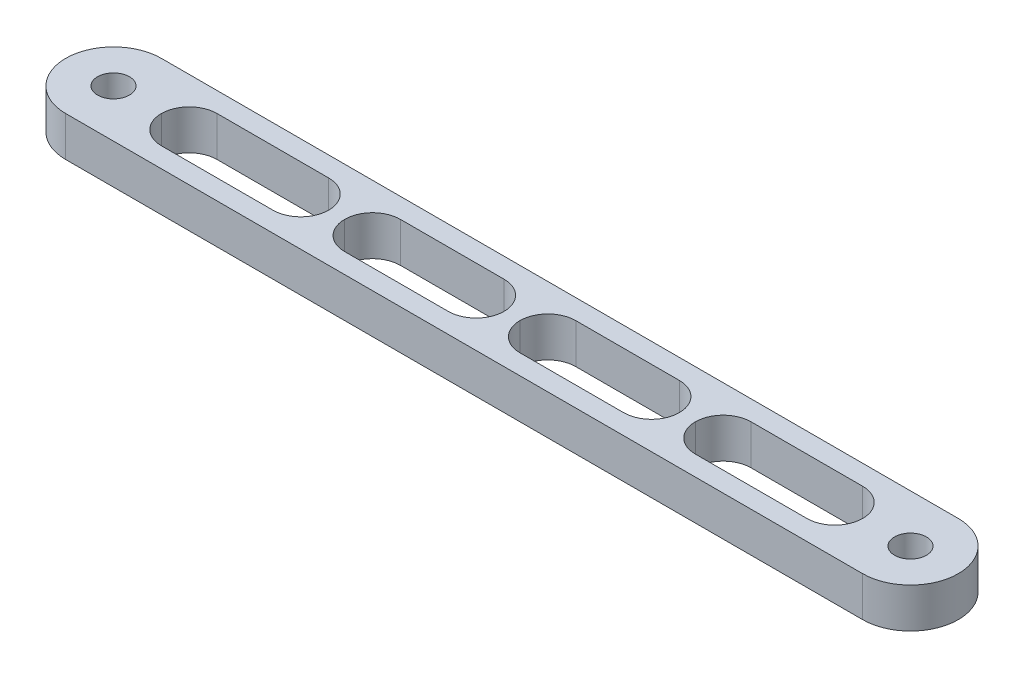
ISO-10303-21;
HEADER;
FILE_DESCRIPTION(('STEP AP214'),'2;1');
FILE_NAME('part.step','',(''),(''),'','','');
FILE_SCHEMA(('AUTOMOTIVE_DESIGN { 1 0 10303 214 1 1 1 1 }'));
ENDSEC;
DATA;
#1=APPLICATION_CONTEXT('core data for automotive mechanical design processes');
#2=APPLICATION_PROTOCOL_DEFINITION('international standard','automotive_design',2000,#1);
#3=PRODUCT_CONTEXT('',#1,'mechanical');
#4=PRODUCT('Part','Part','',(#3));
#5=PRODUCT_RELATED_PRODUCT_CATEGORY('part','',(#4));
#6=PRODUCT_DEFINITION_FORMATION('','',#4);
#7=PRODUCT_DEFINITION_CONTEXT('part definition',#1,'design');
#8=PRODUCT_DEFINITION('design','',#6,#7);
#9=PRODUCT_DEFINITION_SHAPE('','',#8);
#10=(LENGTH_UNIT() NAMED_UNIT(*) SI_UNIT(.MILLI.,.METRE.));
#11=(NAMED_UNIT(*) PLANE_ANGLE_UNIT() SI_UNIT($,.RADIAN.));
#12=(NAMED_UNIT(*) SI_UNIT($,.STERADIAN.) SOLID_ANGLE_UNIT());
#13=UNCERTAINTY_MEASURE_WITH_UNIT(LENGTH_MEASURE(1.E-05),#10,'distance_accuracy_value','');
#14=(GEOMETRIC_REPRESENTATION_CONTEXT(3) GLOBAL_UNCERTAINTY_ASSIGNED_CONTEXT((#13)) GLOBAL_UNIT_ASSIGNED_CONTEXT((#10,
#11,#12)) REPRESENTATION_CONTEXT('',''));
#15=CARTESIAN_POINT('',(0.,0.,0.));
#16=DIRECTION('',(0.,0.,1.));
#17=DIRECTION('',(1.,0.,0.));
#18=AXIS2_PLACEMENT_3D('',#15,#16,#17);
#19=CARTESIAN_POINT('',(-200.,10.,0.));
#20=DIRECTION('',(0.,1.,0.));
#21=DIRECTION('',(0.,0.,1.));
#22=AXIS2_PLACEMENT_3D('',#19,#20,#21);
#23=PLANE('',#22);
#24=CARTESIAN_POINT('',(-200.,10.,0.));
#25=DIRECTION('',(0.,1.,0.));
#26=DIRECTION('',(0.,0.,1.));
#27=AXIS2_PLACEMENT_3D('',#24,#25,#26);
#28=CIRCLE('',#27,3.99999999999999);
#29=CARTESIAN_POINT('',(-200.,10.,3.99999999999999));
#30=VERTEX_POINT('',#29);
#31=EDGE_CURVE('E266',#30,#30,#28,.T.);
#32=ORIENTED_EDGE('',*,*,#31,.F.);
#33=EDGE_LOOP('',(#32));
#34=FACE_BOUND('',#33,.T.);
#35=CARTESIAN_POINT('',(-200.,10.,0.));
#36=DIRECTION('',(0.,1.,0.));
#37=DIRECTION('',(0.,0.,1.));
#38=AXIS2_PLACEMENT_3D('',#35,#36,#37);
#39=CIRCLE('',#38,12.);
#40=CARTESIAN_POINT('',(-200.,10.,-12.));
#41=VERTEX_POINT('',#40);
#42=CARTESIAN_POINT('',(-200.,10.,12.));
#43=VERTEX_POINT('',#42);
#44=EDGE_CURVE('E225',#41,#43,#39,.T.);
#45=ORIENTED_EDGE('',*,*,#44,.T.);
#46=DIRECTION('',(1.,0.,0.));
#47=VECTOR('',#46,1.);
#48=CARTESIAN_POINT('',(-200.,10.,12.));
#49=LINE('',#48,#47);
#50=CARTESIAN_POINT('',(0.,10.,12.));
#51=VERTEX_POINT('',#50);
#52=EDGE_CURVE('E229',#43,#51,#49,.T.);
#53=ORIENTED_EDGE('',*,*,#52,.T.);
#54=CARTESIAN_POINT('',(0.,10.,0.));
#55=DIRECTION('',(0.,1.,0.));
#56=DIRECTION('',(0.,0.,1.));
#57=AXIS2_PLACEMENT_3D('',#54,#55,#56);
#58=CIRCLE('',#57,12.);
#59=CARTESIAN_POINT('',(0.,10.,-12.));
#60=VERTEX_POINT('',#59);
#61=EDGE_CURVE('E253',#51,#60,#58,.T.);
#62=ORIENTED_EDGE('',*,*,#61,.T.);
#63=DIRECTION('',(-1.,0.,0.));
#64=VECTOR('',#63,1.);
#65=CARTESIAN_POINT('',(-200.,10.,-12.));
#66=LINE('',#65,#64);
#67=EDGE_CURVE('E232',#60,#41,#66,.T.);
#68=ORIENTED_EDGE('',*,*,#67,.T.);
#69=EDGE_LOOP('',(#45,#53,#62,#68));
#70=FACE_BOUND('',#69,.T.);
#71=CARTESIAN_POINT('',(0.,10.,0.));
#72=DIRECTION('',(0.,1.,0.));
#73=DIRECTION('',(0.,0.,1.));
#74=AXIS2_PLACEMENT_3D('',#71,#72,#73);
#75=CIRCLE('',#74,4.);
#76=CARTESIAN_POINT('',(0.,10.,4.));
#77=VERTEX_POINT('',#76);
#78=EDGE_CURVE('E493',#77,#77,#75,.T.);
#79=ORIENTED_EDGE('',*,*,#78,.F.);
#80=EDGE_LOOP('',(#79));
#81=FACE_BOUND('',#80,.T.);
#82=CARTESIAN_POINT('',(-181.,10.,0.));
#83=DIRECTION('',(0.,1.,0.));
#84=DIRECTION('',(0.,0.,1.));
#85=AXIS2_PLACEMENT_3D('',#82,#83,#84);
#86=CIRCLE('',#85,7.);
#87=CARTESIAN_POINT('',(-181.,10.,7.));
#88=VERTEX_POINT('',#87);
#89=CARTESIAN_POINT('',(-188.,10.,0.));
#90=VERTEX_POINT('',#89);
#91=EDGE_CURVE('E56',#88,#90,#86,.F.);
#92=ORIENTED_EDGE('',*,*,#91,.T.);
#93=CARTESIAN_POINT('',(-181.,10.,0.));
#94=DIRECTION('',(0.,1.,0.));
#95=DIRECTION('',(0.,0.,1.));
#96=AXIS2_PLACEMENT_3D('',#93,#94,#95);
#97=CIRCLE('',#96,7.);
#98=CARTESIAN_POINT('',(-181.,10.,-6.99999999999998));
#99=VERTEX_POINT('',#98);
#100=EDGE_CURVE('E11',#90,#99,#97,.F.);
#101=ORIENTED_EDGE('',*,*,#100,.T.);
#102=DIRECTION('',(-1.,0.,0.));
#103=VECTOR('',#102,1.);
#104=CARTESIAN_POINT('',(-146.,10.,-6.99999999999998));
#105=LINE('',#104,#103);
#106=CARTESIAN_POINT('',(-153.,10.,-6.99999999999998));
#107=VERTEX_POINT('',#106);
#108=EDGE_CURVE('E469',#107,#99,#105,.T.);
#109=ORIENTED_EDGE('',*,*,#108,.F.);
#110=CARTESIAN_POINT('',(-153.,10.,0.));
#111=DIRECTION('',(0.,1.,0.));
#112=DIRECTION('',(0.,0.,1.));
#113=AXIS2_PLACEMENT_3D('',#110,#111,#112);
#114=CIRCLE('',#113,7.);
#115=CARTESIAN_POINT('',(-146.,10.,0.));
#116=VERTEX_POINT('',#115);
#117=EDGE_CURVE('E376',#107,#116,#114,.F.);
#118=ORIENTED_EDGE('',*,*,#117,.T.);
#119=CARTESIAN_POINT('',(-153.,10.,0.));
#120=DIRECTION('',(0.,1.,0.));
#121=DIRECTION('',(0.,0.,1.));
#122=AXIS2_PLACEMENT_3D('',#119,#120,#121);
#123=CIRCLE('',#122,7.);
#124=CARTESIAN_POINT('',(-153.,10.,7.));
#125=VERTEX_POINT('',#124);
#126=EDGE_CURVE('E382',#116,#125,#123,.F.);
#127=ORIENTED_EDGE('',*,*,#126,.T.);
#128=DIRECTION('',(1.,0.,0.));
#129=VECTOR('',#128,1.);
#130=CARTESIAN_POINT('',(-188.,10.,7.));
#131=LINE('',#130,#129);
#132=EDGE_CURVE('E475',#88,#125,#131,.T.);
#133=ORIENTED_EDGE('',*,*,#132,.F.);
#134=EDGE_LOOP('',(#92,#101,#109,#118,#127,#133));
#135=FACE_BOUND('',#134,.T.);
#136=DIRECTION('',(1.,0.,0.));
#137=VECTOR('',#136,1.);
#138=CARTESIAN_POINT('',(-142.,10.,6.99999999999999));
#139=LINE('',#138,#137);
#140=CARTESIAN_POINT('',(-135.,10.,6.99999999999999));
#141=VERTEX_POINT('',#140);
#142=CARTESIAN_POINT('',(-109.,10.,6.99999999999999));
#143=VERTEX_POINT('',#142);
#144=EDGE_CURVE('E491',#141,#143,#139,.T.);
#145=ORIENTED_EDGE('',*,*,#144,.F.);
#146=CARTESIAN_POINT('',(-135.,10.,0.));
#147=DIRECTION('',(0.,1.,0.));
#148=DIRECTION('',(0.,0.,1.));
#149=AXIS2_PLACEMENT_3D('',#146,#147,#148);
#150=CIRCLE('',#149,7.);
#151=CARTESIAN_POINT('',(-142.,10.,0.));
#152=VERTEX_POINT('',#151);
#153=EDGE_CURVE('E418',#141,#152,#150,.F.);
#154=ORIENTED_EDGE('',*,*,#153,.T.);
#155=CARTESIAN_POINT('',(-135.,10.,0.));
#156=DIRECTION('',(0.,1.,0.));
#157=DIRECTION('',(0.,0.,1.));
#158=AXIS2_PLACEMENT_3D('',#155,#156,#157);
#159=CIRCLE('',#158,7.);
#160=CARTESIAN_POINT('',(-135.,10.,-6.99999999999998));
#161=VERTEX_POINT('',#160);
#162=EDGE_CURVE('E340',#152,#161,#159,.F.);
#163=ORIENTED_EDGE('',*,*,#162,.T.);
#164=DIRECTION('',(-1.,0.,0.));
#165=VECTOR('',#164,1.);
#166=CARTESIAN_POINT('',(-102.,10.,-6.99999999999999));
#167=LINE('',#166,#165);
#168=CARTESIAN_POINT('',(-109.,10.,-6.99999999999999));
#169=VERTEX_POINT('',#168);
#170=EDGE_CURVE('E832',#169,#161,#167,.T.);
#171=ORIENTED_EDGE('',*,*,#170,.F.);
#172=CARTESIAN_POINT('',(-109.,10.,0.));
#173=DIRECTION('',(0.,1.,0.));
#174=DIRECTION('',(0.,0.,1.));
#175=AXIS2_PLACEMENT_3D('',#172,#173,#174);
#176=CIRCLE('',#175,7.);
#177=CARTESIAN_POINT('',(-102.,10.,0.));
#178=VERTEX_POINT('',#177);
#179=EDGE_CURVE('E370',#169,#178,#176,.F.);
#180=ORIENTED_EDGE('',*,*,#179,.T.);
#181=CARTESIAN_POINT('',(-109.,10.,0.));
#182=DIRECTION('',(0.,1.,0.));
#183=DIRECTION('',(0.,0.,1.));
#184=AXIS2_PLACEMENT_3D('',#181,#182,#183);
#185=CIRCLE('',#184,7.);
#186=EDGE_CURVE('E388',#178,#143,#185,.F.);
#187=ORIENTED_EDGE('',*,*,#186,.T.);
#188=EDGE_LOOP('',(#145,#154,#163,#171,#180,#187));
#189=FACE_BOUND('',#188,.T.);
#190=DIRECTION('',(1.,0.,0.));
#191=VECTOR('',#190,1.);
#192=CARTESIAN_POINT('',(-98.,10.,6.99999999999998));
#193=LINE('',#192,#191);
#194=CARTESIAN_POINT('',(-91.,10.,6.99999999999998));
#195=VERTEX_POINT('',#194);
#196=CARTESIAN_POINT('',(-65.,10.,6.99999999999998));
#197=VERTEX_POINT('',#196);
#198=EDGE_CURVE('E858',#195,#197,#193,.T.);
#199=ORIENTED_EDGE('',*,*,#198,.F.);
#200=CARTESIAN_POINT('',(-91.,10.,0.));
#201=DIRECTION('',(0.,1.,0.));
#202=DIRECTION('',(0.,0.,1.));
#203=AXIS2_PLACEMENT_3D('',#200,#201,#202);
#204=CIRCLE('',#203,7.);
#205=CARTESIAN_POINT('',(-98.,10.,0.));
#206=VERTEX_POINT('',#205);
#207=EDGE_CURVE('E412',#195,#206,#204,.F.);
#208=ORIENTED_EDGE('',*,*,#207,.T.);
#209=CARTESIAN_POINT('',(-91.,10.,0.));
#210=DIRECTION('',(0.,1.,0.));
#211=DIRECTION('',(0.,0.,1.));
#212=AXIS2_PLACEMENT_3D('',#209,#210,#211);
#213=CIRCLE('',#212,7.);
#214=CARTESIAN_POINT('',(-91.,10.,-6.99999999999999));
#215=VERTEX_POINT('',#214);
#216=EDGE_CURVE('E346',#206,#215,#213,.F.);
#217=ORIENTED_EDGE('',*,*,#216,.T.);
#218=DIRECTION('',(-1.,0.,0.));
#219=VECTOR('',#218,1.);
#220=CARTESIAN_POINT('',(-98.,10.,-6.99999999999999));
#221=LINE('',#220,#219);
#222=CARTESIAN_POINT('',(-65.,10.,-6.99999999999999));
#223=VERTEX_POINT('',#222);
#224=EDGE_CURVE('E862',#223,#215,#221,.T.);
#225=ORIENTED_EDGE('',*,*,#224,.F.);
#226=CARTESIAN_POINT('',(-65.,10.,0.));
#227=DIRECTION('',(0.,1.,0.));
#228=DIRECTION('',(0.,0.,1.));
#229=AXIS2_PLACEMENT_3D('',#226,#227,#228);
#230=CIRCLE('',#229,7.);
#231=CARTESIAN_POINT('',(-58.,10.,0.));
#232=VERTEX_POINT('',#231);
#233=EDGE_CURVE('E358',#223,#232,#230,.F.);
#234=ORIENTED_EDGE('',*,*,#233,.T.);
#235=CARTESIAN_POINT('',(-65.,10.,0.));
#236=DIRECTION('',(0.,1.,0.));
#237=DIRECTION('',(0.,0.,1.));
#238=AXIS2_PLACEMENT_3D('',#235,#236,#237);
#239=CIRCLE('',#238,7.);
#240=EDGE_CURVE('E394',#232,#197,#239,.F.);
#241=ORIENTED_EDGE('',*,*,#240,.T.);
#242=EDGE_LOOP('',(#199,#208,#217,#225,#234,#241));
#243=FACE_BOUND('',#242,.T.);
#244=DIRECTION('',(1.,0.,0.));
#245=VECTOR('',#244,1.);
#246=CARTESIAN_POINT('',(-54.,10.,6.99999999999997));
#247=LINE('',#246,#245);
#248=CARTESIAN_POINT('',(-47.,10.,6.99999999999997));
#249=VERTEX_POINT('',#248);
#250=CARTESIAN_POINT('',(-19.,10.,6.99999999999999));
#251=VERTEX_POINT('',#250);
#252=EDGE_CURVE('E875',#249,#251,#247,.T.);
#253=ORIENTED_EDGE('',*,*,#252,.F.);
#254=CARTESIAN_POINT('',(-47.,10.,0.));
#255=DIRECTION('',(0.,1.,0.));
#256=DIRECTION('',(0.,0.,1.));
#257=AXIS2_PLACEMENT_3D('',#254,#255,#256);
#258=CIRCLE('',#257,7.);
#259=CARTESIAN_POINT('',(-54.,10.,0.));
#260=VERTEX_POINT('',#259);
#261=EDGE_CURVE('E406',#249,#260,#258,.F.);
#262=ORIENTED_EDGE('',*,*,#261,.T.);
#263=CARTESIAN_POINT('',(-47.,10.,0.));
#264=DIRECTION('',(0.,1.,0.));
#265=DIRECTION('',(0.,0.,1.));
#266=AXIS2_PLACEMENT_3D('',#263,#264,#265);
#267=CIRCLE('',#266,7.);
#268=CARTESIAN_POINT('',(-47.,10.,-6.99999999999999));
#269=VERTEX_POINT('',#268);
#270=EDGE_CURVE('E352',#260,#269,#267,.F.);
#271=ORIENTED_EDGE('',*,*,#270,.T.);
#272=DIRECTION('',(-1.,0.,0.));
#273=VECTOR('',#272,1.);
#274=CARTESIAN_POINT('',(-54.,10.,-6.99999999999999));
#275=LINE('',#274,#273);
#276=CARTESIAN_POINT('',(-19.,10.,-6.99999999999998));
#277=VERTEX_POINT('',#276);
#278=EDGE_CURVE('E900',#277,#269,#275,.T.);
#279=ORIENTED_EDGE('',*,*,#278,.F.);
#280=CARTESIAN_POINT('',(-19.,10.,0.));
#281=DIRECTION('',(0.,1.,0.));
#282=DIRECTION('',(0.,0.,1.));
#283=AXIS2_PLACEMENT_3D('',#280,#281,#282);
#284=CIRCLE('',#283,7.);
#285=CARTESIAN_POINT('',(-12.,10.,0.));
#286=VERTEX_POINT('',#285);
#287=EDGE_CURVE('E364',#277,#286,#284,.F.);
#288=ORIENTED_EDGE('',*,*,#287,.T.);
#289=CARTESIAN_POINT('',(-19.,10.,0.));
#290=DIRECTION('',(0.,1.,0.));
#291=DIRECTION('',(0.,0.,1.));
#292=AXIS2_PLACEMENT_3D('',#289,#290,#291);
#293=CIRCLE('',#292,7.);
#294=EDGE_CURVE('E400',#286,#251,#293,.F.);
#295=ORIENTED_EDGE('',*,*,#294,.T.);
#296=EDGE_LOOP('',(#253,#262,#271,#279,#288,#295));
#297=FACE_BOUND('',#296,.T.);
#298=ADVANCED_FACE('F39',(#34,#70,#81,#135,#189,#243,#297),#23,.T.);
#299=CARTESIAN_POINT('',(-200.,0.,0.));
#300=DIRECTION('',(0.,1.,0.));
#301=DIRECTION('',(0.,0.,1.));
#302=AXIS2_PLACEMENT_3D('',#299,#300,#301);
#303=PLANE('',#302);
#304=DIRECTION('',(1.,0.,0.));
#305=VECTOR('',#304,1.);
#306=CARTESIAN_POINT('',(-98.,0.,6.99999999999998));
#307=LINE('',#306,#305);
#308=CARTESIAN_POINT('',(-91.,0.,6.99999999999998));
#309=VERTEX_POINT('',#308);
#310=CARTESIAN_POINT('',(-65.,0.,6.99999999999998));
#311=VERTEX_POINT('',#310);
#312=EDGE_CURVE('E868',#309,#311,#307,.T.);
#313=ORIENTED_EDGE('',*,*,#312,.T.);
#314=CARTESIAN_POINT('',(-65.,0.,0.));
#315=DIRECTION('',(0.,1.,0.));
#316=DIRECTION('',(0.,0.,1.));
#317=AXIS2_PLACEMENT_3D('',#314,#315,#316);
#318=CIRCLE('',#317,7.);
#319=CARTESIAN_POINT('',(-58.,0.,0.));
#320=VERTEX_POINT('',#319);
#321=EDGE_CURVE('E391',#311,#320,#318,.T.);
#322=ORIENTED_EDGE('',*,*,#321,.T.);
#323=CARTESIAN_POINT('',(-65.,0.,0.));
#324=DIRECTION('',(0.,1.,0.));
#325=DIRECTION('',(0.,0.,1.));
#326=AXIS2_PLACEMENT_3D('',#323,#324,#325);
#327=CIRCLE('',#326,7.);
#328=CARTESIAN_POINT('',(-65.,0.,-6.99999999999999));
#329=VERTEX_POINT('',#328);
#330=EDGE_CURVE('E355',#320,#329,#327,.T.);
#331=ORIENTED_EDGE('',*,*,#330,.T.);
#332=DIRECTION('',(-1.,0.,0.));
#333=VECTOR('',#332,1.);
#334=CARTESIAN_POINT('',(-98.,0.,-6.99999999999999));
#335=LINE('',#334,#333);
#336=CARTESIAN_POINT('',(-91.,0.,-6.99999999999999));
#337=VERTEX_POINT('',#336);
#338=EDGE_CURVE('E872',#329,#337,#335,.T.);
#339=ORIENTED_EDGE('',*,*,#338,.T.);
#340=CARTESIAN_POINT('',(-91.,0.,0.));
#341=DIRECTION('',(0.,1.,0.));
#342=DIRECTION('',(0.,0.,1.));
#343=AXIS2_PLACEMENT_3D('',#340,#341,#342);
#344=CIRCLE('',#343,7.);
#345=CARTESIAN_POINT('',(-98.,0.,0.));
#346=VERTEX_POINT('',#345);
#347=EDGE_CURVE('E343',#337,#346,#344,.T.);
#348=ORIENTED_EDGE('',*,*,#347,.T.);
#349=CARTESIAN_POINT('',(-91.,0.,0.));
#350=DIRECTION('',(0.,1.,0.));
#351=DIRECTION('',(0.,0.,1.));
#352=AXIS2_PLACEMENT_3D('',#349,#350,#351);
#353=CIRCLE('',#352,7.);
#354=EDGE_CURVE('E409',#346,#309,#353,.T.);
#355=ORIENTED_EDGE('',*,*,#354,.T.);
#356=EDGE_LOOP('',(#313,#322,#331,#339,#348,#355));
#357=FACE_BOUND('',#356,.T.);
#358=DIRECTION('',(1.,0.,0.));
#359=VECTOR('',#358,1.);
#360=CARTESIAN_POINT('',(-188.,0.,7.));
#361=LINE('',#360,#359);
#362=CARTESIAN_POINT('',(-181.,0.,7.));
#363=VERTEX_POINT('',#362);
#364=CARTESIAN_POINT('',(-153.,0.,7.));
#365=VERTEX_POINT('',#364);
#366=EDGE_CURVE('E476',#363,#365,#361,.T.);
#367=ORIENTED_EDGE('',*,*,#366,.T.);
#368=CARTESIAN_POINT('',(-153.,0.,0.));
#369=DIRECTION('',(0.,1.,0.));
#370=DIRECTION('',(0.,0.,1.));
#371=AXIS2_PLACEMENT_3D('',#368,#369,#370);
#372=CIRCLE('',#371,7.);
#373=CARTESIAN_POINT('',(-146.,0.,0.));
#374=VERTEX_POINT('',#373);
#375=EDGE_CURVE('E379',#365,#374,#372,.T.);
#376=ORIENTED_EDGE('',*,*,#375,.T.);
#377=CARTESIAN_POINT('',(-153.,0.,0.));
#378=DIRECTION('',(0.,1.,0.));
#379=DIRECTION('',(0.,0.,1.));
#380=AXIS2_PLACEMENT_3D('',#377,#378,#379);
#381=CIRCLE('',#380,7.);
#382=CARTESIAN_POINT('',(-153.,0.,-6.99999999999998));
#383=VERTEX_POINT('',#382);
#384=EDGE_CURVE('E373',#374,#383,#381,.T.);
#385=ORIENTED_EDGE('',*,*,#384,.T.);
#386=DIRECTION('',(-1.,0.,0.));
#387=VECTOR('',#386,1.);
#388=CARTESIAN_POINT('',(-146.,0.,-6.99999999999998));
#389=LINE('',#388,#387);
#390=CARTESIAN_POINT('',(-181.,0.,-6.99999999999998));
#391=VERTEX_POINT('',#390);
#392=EDGE_CURVE('E484',#383,#391,#389,.T.);
#393=ORIENTED_EDGE('',*,*,#392,.T.);
#394=CARTESIAN_POINT('',(-181.,0.,0.));
#395=DIRECTION('',(0.,1.,0.));
#396=DIRECTION('',(0.,0.,1.));
#397=AXIS2_PLACEMENT_3D('',#394,#395,#396);
#398=CIRCLE('',#397,7.);
#399=CARTESIAN_POINT('',(-188.,0.,0.));
#400=VERTEX_POINT('',#399);
#401=EDGE_CURVE('E49',#391,#400,#398,.T.);
#402=ORIENTED_EDGE('',*,*,#401,.T.);
#403=CARTESIAN_POINT('',(-181.,0.,0.));
#404=DIRECTION('',(0.,1.,0.));
#405=DIRECTION('',(0.,0.,1.));
#406=AXIS2_PLACEMENT_3D('',#403,#404,#405);
#407=CIRCLE('',#406,7.);
#408=EDGE_CURVE('E421',#400,#363,#407,.T.);
#409=ORIENTED_EDGE('',*,*,#408,.T.);
#410=EDGE_LOOP('',(#367,#376,#385,#393,#402,#409));
#411=FACE_BOUND('',#410,.T.);
#412=DIRECTION('',(1.,0.,0.));
#413=VECTOR('',#412,1.);
#414=CARTESIAN_POINT('',(-200.,0.,12.));
#415=LINE('',#414,#413);
#416=CARTESIAN_POINT('',(-200.,0.,12.));
#417=VERTEX_POINT('',#416);
#418=CARTESIAN_POINT('',(0.,0.,12.));
#419=VERTEX_POINT('',#418);
#420=EDGE_CURVE('E262',#417,#419,#415,.T.);
#421=ORIENTED_EDGE('',*,*,#420,.F.);
#422=CARTESIAN_POINT('',(-200.,0.,0.));
#423=DIRECTION('',(0.,1.,0.));
#424=DIRECTION('',(0.,0.,-1.));
#425=AXIS2_PLACEMENT_3D('',#422,#423,#424);
#426=CIRCLE('',#425,12.);
#427=CARTESIAN_POINT('',(-200.,0.,-12.));
#428=VERTEX_POINT('',#427);
#429=EDGE_CURVE('E237',#428,#417,#426,.T.);
#430=ORIENTED_EDGE('',*,*,#429,.F.);
#431=DIRECTION('',(-1.,0.,0.));
#432=VECTOR('',#431,1.);
#433=CARTESIAN_POINT('',(-200.,0.,-12.));
#434=LINE('',#433,#432);
#435=CARTESIAN_POINT('',(0.,0.,-12.));
#436=VERTEX_POINT('',#435);
#437=EDGE_CURVE('E269',#436,#428,#434,.T.);
#438=ORIENTED_EDGE('',*,*,#437,.F.);
#439=CARTESIAN_POINT('',(0.,0.,0.));
#440=DIRECTION('',(0.,1.,0.));
#441=DIRECTION('',(0.,0.,1.));
#442=AXIS2_PLACEMENT_3D('',#439,#440,#441);
#443=CIRCLE('',#442,12.);
#444=EDGE_CURVE('E265',#419,#436,#443,.T.);
#445=ORIENTED_EDGE('',*,*,#444,.F.);
#446=EDGE_LOOP('',(#421,#430,#438,#445));
#447=FACE_BOUND('',#446,.T.);
#448=CARTESIAN_POINT('',(-200.,0.,0.));
#449=DIRECTION('',(0.,1.,0.));
#450=DIRECTION('',(0.,0.,1.));
#451=AXIS2_PLACEMENT_3D('',#448,#449,#450);
#452=CIRCLE('',#451,3.99999999999999);
#453=CARTESIAN_POINT('',(-200.,0.,3.99999999999999));
#454=VERTEX_POINT('',#453);
#455=EDGE_CURVE('E497',#454,#454,#452,.T.);
#456=ORIENTED_EDGE('',*,*,#455,.T.);
#457=EDGE_LOOP('',(#456));
#458=FACE_BOUND('',#457,.T.);
#459=CARTESIAN_POINT('',(0.,0.,0.));
#460=DIRECTION('',(0.,1.,0.));
#461=DIRECTION('',(0.,0.,1.));
#462=AXIS2_PLACEMENT_3D('',#459,#460,#461);
#463=CIRCLE('',#462,4.);
#464=CARTESIAN_POINT('',(0.,0.,4.));
#465=VERTEX_POINT('',#464);
#466=EDGE_CURVE('E481',#465,#465,#463,.T.);
#467=ORIENTED_EDGE('',*,*,#466,.T.);
#468=EDGE_LOOP('',(#467));
#469=FACE_BOUND('',#468,.T.);
#470=DIRECTION('',(1.,0.,0.));
#471=VECTOR('',#470,1.);
#472=CARTESIAN_POINT('',(-142.,0.,6.99999999999999));
#473=LINE('',#472,#471);
#474=CARTESIAN_POINT('',(-135.,0.,6.99999999999999));
#475=VERTEX_POINT('',#474);
#476=CARTESIAN_POINT('',(-109.,0.,6.99999999999999));
#477=VERTEX_POINT('',#476);
#478=EDGE_CURVE('E487',#475,#477,#473,.T.);
#479=ORIENTED_EDGE('',*,*,#478,.T.);
#480=CARTESIAN_POINT('',(-109.,0.,0.));
#481=DIRECTION('',(0.,1.,0.));
#482=DIRECTION('',(0.,0.,1.));
#483=AXIS2_PLACEMENT_3D('',#480,#481,#482);
#484=CIRCLE('',#483,7.);
#485=CARTESIAN_POINT('',(-102.,0.,0.));
#486=VERTEX_POINT('',#485);
#487=EDGE_CURVE('E385',#477,#486,#484,.T.);
#488=ORIENTED_EDGE('',*,*,#487,.T.);
#489=CARTESIAN_POINT('',(-109.,0.,0.));
#490=DIRECTION('',(0.,1.,0.));
#491=DIRECTION('',(0.,0.,1.));
#492=AXIS2_PLACEMENT_3D('',#489,#490,#491);
#493=CIRCLE('',#492,7.);
#494=CARTESIAN_POINT('',(-109.,0.,-6.99999999999999));
#495=VERTEX_POINT('',#494);
#496=EDGE_CURVE('E367',#486,#495,#493,.T.);
#497=ORIENTED_EDGE('',*,*,#496,.T.);
#498=DIRECTION('',(-1.,0.,0.));
#499=VECTOR('',#498,1.);
#500=CARTESIAN_POINT('',(-102.,0.,-6.99999999999999));
#501=LINE('',#500,#499);
#502=CARTESIAN_POINT('',(-135.,0.,-6.99999999999998));
#503=VERTEX_POINT('',#502);
#504=EDGE_CURVE('E846',#495,#503,#501,.T.);
#505=ORIENTED_EDGE('',*,*,#504,.T.);
#506=CARTESIAN_POINT('',(-135.,0.,0.));
#507=DIRECTION('',(0.,1.,0.));
#508=DIRECTION('',(0.,0.,1.));
#509=AXIS2_PLACEMENT_3D('',#506,#507,#508);
#510=CIRCLE('',#509,7.);
#511=CARTESIAN_POINT('',(-142.,0.,0.));
#512=VERTEX_POINT('',#511);
#513=EDGE_CURVE('E337',#503,#512,#510,.T.);
#514=ORIENTED_EDGE('',*,*,#513,.T.);
#515=CARTESIAN_POINT('',(-135.,0.,0.));
#516=DIRECTION('',(0.,1.,0.));
#517=DIRECTION('',(0.,0.,1.));
#518=AXIS2_PLACEMENT_3D('',#515,#516,#517);
#519=CIRCLE('',#518,7.);
#520=EDGE_CURVE('E415',#512,#475,#519,.T.);
#521=ORIENTED_EDGE('',*,*,#520,.T.);
#522=EDGE_LOOP('',(#479,#488,#497,#505,#514,#521));
#523=FACE_BOUND('',#522,.T.);
#524=DIRECTION('',(1.,0.,0.));
#525=VECTOR('',#524,1.);
#526=CARTESIAN_POINT('',(-54.,0.,6.99999999999997));
#527=LINE('',#526,#525);
#528=CARTESIAN_POINT('',(-47.,0.,6.99999999999997));
#529=VERTEX_POINT('',#528);
#530=CARTESIAN_POINT('',(-19.,0.,6.99999999999999));
#531=VERTEX_POINT('',#530);
#532=EDGE_CURVE('E912',#529,#531,#527,.T.);
#533=ORIENTED_EDGE('',*,*,#532,.T.);
#534=CARTESIAN_POINT('',(-19.,0.,0.));
#535=DIRECTION('',(0.,1.,0.));
#536=DIRECTION('',(0.,0.,1.));
#537=AXIS2_PLACEMENT_3D('',#534,#535,#536);
#538=CIRCLE('',#537,7.);
#539=CARTESIAN_POINT('',(-12.,0.,0.));
#540=VERTEX_POINT('',#539);
#541=EDGE_CURVE('E397',#531,#540,#538,.T.);
#542=ORIENTED_EDGE('',*,*,#541,.T.);
#543=CARTESIAN_POINT('',(-19.,0.,0.));
#544=DIRECTION('',(0.,1.,0.));
#545=DIRECTION('',(0.,0.,1.));
#546=AXIS2_PLACEMENT_3D('',#543,#544,#545);
#547=CIRCLE('',#546,7.);
#548=CARTESIAN_POINT('',(-19.,0.,-6.99999999999998));
#549=VERTEX_POINT('',#548);
#550=EDGE_CURVE('E361',#540,#549,#547,.T.);
#551=ORIENTED_EDGE('',*,*,#550,.T.);
#552=DIRECTION('',(-1.,0.,0.));
#553=VECTOR('',#552,1.);
#554=CARTESIAN_POINT('',(-54.,0.,-6.99999999999999));
#555=LINE('',#554,#553);
#556=CARTESIAN_POINT('',(-47.,0.,-6.99999999999999));
#557=VERTEX_POINT('',#556);
#558=EDGE_CURVE('E432',#549,#557,#555,.T.);
#559=ORIENTED_EDGE('',*,*,#558,.T.);
#560=CARTESIAN_POINT('',(-47.,0.,0.));
#561=DIRECTION('',(0.,1.,0.));
#562=DIRECTION('',(0.,0.,1.));
#563=AXIS2_PLACEMENT_3D('',#560,#561,#562);
#564=CIRCLE('',#563,7.);
#565=CARTESIAN_POINT('',(-54.,0.,0.));
#566=VERTEX_POINT('',#565);
#567=EDGE_CURVE('E349',#557,#566,#564,.T.);
#568=ORIENTED_EDGE('',*,*,#567,.T.);
#569=CARTESIAN_POINT('',(-47.,0.,0.));
#570=DIRECTION('',(0.,1.,0.));
#571=DIRECTION('',(0.,0.,1.));
#572=AXIS2_PLACEMENT_3D('',#569,#570,#571);
#573=CIRCLE('',#572,7.);
#574=EDGE_CURVE('E403',#566,#529,#573,.T.);
#575=ORIENTED_EDGE('',*,*,#574,.T.);
#576=EDGE_LOOP('',(#533,#542,#551,#559,#568,#575));
#577=FACE_BOUND('',#576,.T.);
#578=ADVANCED_FACE('F507',(#357,#411,#447,#458,#469,#523,#577),#303,.F.);
#579=CARTESIAN_POINT('',(-200.,10.,12.));
#580=DIRECTION('',(0.,0.,-1.));
#581=DIRECTION('',(-1.,0.,0.));
#582=AXIS2_PLACEMENT_3D('',#579,#580,#581);
#583=PLANE('',#582);
#584=ORIENTED_EDGE('',*,*,#420,.T.);
#585=DIRECTION('',(0.,-1.,0.));
#586=VECTOR('',#585,1.);
#587=CARTESIAN_POINT('',(0.,10.,12.));
#588=LINE('',#587,#586);
#589=EDGE_CURVE('E247',#51,#419,#588,.T.);
#590=ORIENTED_EDGE('',*,*,#589,.F.);
#591=ORIENTED_EDGE('',*,*,#52,.F.);
#592=DIRECTION('',(0.,-1.,0.));
#593=VECTOR('',#592,1.);
#594=CARTESIAN_POINT('',(-200.,10.,12.));
#595=LINE('',#594,#593);
#596=EDGE_CURVE('E240',#43,#417,#595,.T.);
#597=ORIENTED_EDGE('',*,*,#596,.T.);
#598=EDGE_LOOP('',(#584,#590,#591,#597));
#599=FACE_BOUND('',#598,.T.);
#600=ADVANCED_FACE('F249',(#599),#583,.F.);
#601=CARTESIAN_POINT('',(0.,10.,0.));
#602=DIRECTION('',(0.,-1.,0.));
#603=DIRECTION('',(0.,0.,-1.));
#604=AXIS2_PLACEMENT_3D('',#601,#602,#603);
#605=CYLINDRICAL_SURFACE('',#604,12.);
#606=ORIENTED_EDGE('',*,*,#444,.T.);
#607=DIRECTION('',(0.,-1.,0.));
#608=VECTOR('',#607,1.);
#609=CARTESIAN_POINT('',(0.,10.,-12.));
#610=LINE('',#609,#608);
#611=EDGE_CURVE('E276',#60,#436,#610,.T.);
#612=ORIENTED_EDGE('',*,*,#611,.F.);
#613=ORIENTED_EDGE('',*,*,#61,.F.);
#614=ORIENTED_EDGE('',*,*,#589,.T.);
#615=EDGE_LOOP('',(#606,#612,#613,#614));
#616=FACE_BOUND('',#615,.T.);
#617=ADVANCED_FACE('F535',(#616),#605,.T.);
#618=CARTESIAN_POINT('',(-200.,10.,-12.));
#619=DIRECTION('',(0.,0.,1.));
#620=DIRECTION('',(1.,0.,0.));
#621=AXIS2_PLACEMENT_3D('',#618,#619,#620);
#622=PLANE('',#621);
#623=ORIENTED_EDGE('',*,*,#437,.T.);
#624=DIRECTION('',(0.,-1.,0.));
#625=VECTOR('',#624,1.);
#626=CARTESIAN_POINT('',(-200.,10.,-12.));
#627=LINE('',#626,#625);
#628=EDGE_CURVE('E261',#41,#428,#627,.T.);
#629=ORIENTED_EDGE('',*,*,#628,.F.);
#630=ORIENTED_EDGE('',*,*,#67,.F.);
#631=ORIENTED_EDGE('',*,*,#611,.T.);
#632=EDGE_LOOP('',(#623,#629,#630,#631));
#633=FACE_BOUND('',#632,.T.);
#634=ADVANCED_FACE('F521',(#633),#622,.F.);
#635=CARTESIAN_POINT('',(-200.,10.,0.));
#636=DIRECTION('',(0.,-1.,0.));
#637=DIRECTION('',(0.,0.,-1.));
#638=AXIS2_PLACEMENT_3D('',#635,#636,#637);
#639=CYLINDRICAL_SURFACE('',#638,12.);
#640=ORIENTED_EDGE('',*,*,#429,.T.);
#641=ORIENTED_EDGE('',*,*,#596,.F.);
#642=ORIENTED_EDGE('',*,*,#44,.F.);
#643=ORIENTED_EDGE('',*,*,#628,.T.);
#644=EDGE_LOOP('',(#640,#641,#642,#643));
#645=FACE_BOUND('',#644,.T.);
#646=ADVANCED_FACE('F241',(#645),#639,.T.);
#647=CARTESIAN_POINT('',(-200.,10.,0.));
#648=DIRECTION('',(0.,-1.,0.));
#649=DIRECTION('',(0.,0.,-1.));
#650=AXIS2_PLACEMENT_3D('',#647,#648,#649);
#651=CYLINDRICAL_SURFACE('',#650,3.99999999999999);
#652=ORIENTED_EDGE('',*,*,#31,.T.);
#653=EDGE_LOOP('',(#652));
#654=FACE_BOUND('',#653,.T.);
#655=ORIENTED_EDGE('',*,*,#455,.F.);
#656=EDGE_LOOP('',(#655));
#657=FACE_BOUND('',#656,.T.);
#658=ADVANCED_FACE('F510',(#654,#657),#651,.F.);
#659=CARTESIAN_POINT('',(0.,10.,0.));
#660=DIRECTION('',(0.,-1.,0.));
#661=DIRECTION('',(0.,0.,-1.));
#662=AXIS2_PLACEMENT_3D('',#659,#660,#661);
#663=CYLINDRICAL_SURFACE('',#662,4.);
#664=ORIENTED_EDGE('',*,*,#78,.T.);
#665=EDGE_LOOP('',(#664));
#666=FACE_BOUND('',#665,.T.);
#667=ORIENTED_EDGE('',*,*,#466,.F.);
#668=EDGE_LOOP('',(#667));
#669=FACE_BOUND('',#668,.T.);
#670=ADVANCED_FACE('F512',(#666,#669),#663,.F.);
#671=CARTESIAN_POINT('',(-146.,10.,-6.99999999999998));
#672=DIRECTION('',(0.,0.,1.));
#673=DIRECTION('',(1.,0.,0.));
#674=AXIS2_PLACEMENT_3D('',#671,#672,#673);
#675=PLANE('',#674);
#676=ORIENTED_EDGE('',*,*,#392,.F.);
#677=DIRECTION('',(0.,-1.,0.));
#678=VECTOR('',#677,1.);
#679=CARTESIAN_POINT('',(-153.,10.,-6.99999999999998));
#680=LINE('',#679,#678);
#681=EDGE_CURVE('E308',#383,#107,#680,.F.);
#682=ORIENTED_EDGE('',*,*,#681,.T.);
#683=ORIENTED_EDGE('',*,*,#108,.T.);
#684=DIRECTION('',(0.,-1.,0.));
#685=VECTOR('',#684,1.);
#686=CARTESIAN_POINT('',(-181.,0.,-6.99999999999998));
#687=LINE('',#686,#685);
#688=EDGE_CURVE('E305',#99,#391,#687,.T.);
#689=ORIENTED_EDGE('',*,*,#688,.T.);
#690=EDGE_LOOP('',(#676,#682,#683,#689));
#691=FACE_BOUND('',#690,.T.);
#692=ADVANCED_FACE('F472',(#691),#675,.T.);
#693=CARTESIAN_POINT('',(-188.,10.,7.));
#694=DIRECTION('',(0.,0.,-1.));
#695=DIRECTION('',(-1.,0.,0.));
#696=AXIS2_PLACEMENT_3D('',#693,#694,#695);
#697=PLANE('',#696);
#698=ORIENTED_EDGE('',*,*,#132,.T.);
#699=DIRECTION('',(0.,-1.,0.));
#700=VECTOR('',#699,1.);
#701=CARTESIAN_POINT('',(-153.,0.,7.));
#702=LINE('',#701,#700);
#703=EDGE_CURVE('E316',#125,#365,#702,.T.);
#704=ORIENTED_EDGE('',*,*,#703,.T.);
#705=ORIENTED_EDGE('',*,*,#366,.F.);
#706=DIRECTION('',(0.,-1.,0.));
#707=VECTOR('',#706,1.);
#708=CARTESIAN_POINT('',(-181.,10.,7.));
#709=LINE('',#708,#707);
#710=EDGE_CURVE('E312',#363,#88,#709,.F.);
#711=ORIENTED_EDGE('',*,*,#710,.T.);
#712=EDGE_LOOP('',(#698,#704,#705,#711));
#713=FACE_BOUND('',#712,.T.);
#714=ADVANCED_FACE('F705',(#713),#697,.T.);
#715=CARTESIAN_POINT('',(-102.,10.,-6.99999999999999));
#716=DIRECTION('',(0.,0.,1.));
#717=DIRECTION('',(1.,0.,0.));
#718=AXIS2_PLACEMENT_3D('',#715,#716,#717);
#719=PLANE('',#718);
#720=ORIENTED_EDGE('',*,*,#170,.T.);
#721=DIRECTION('',(0.,-1.,0.));
#722=VECTOR('',#721,1.);
#723=CARTESIAN_POINT('',(-135.,0.,-6.99999999999998));
#724=LINE('',#723,#722);
#725=EDGE_CURVE('E285',#161,#503,#724,.T.);
#726=ORIENTED_EDGE('',*,*,#725,.T.);
#727=ORIENTED_EDGE('',*,*,#504,.F.);
#728=DIRECTION('',(0.,-1.,0.));
#729=VECTOR('',#728,1.);
#730=CARTESIAN_POINT('',(-109.,10.,-6.99999999999999));
#731=LINE('',#730,#729);
#732=EDGE_CURVE('E246',#495,#169,#731,.F.);
#733=ORIENTED_EDGE('',*,*,#732,.T.);
#734=EDGE_LOOP('',(#720,#726,#727,#733));
#735=FACE_BOUND('',#734,.T.);
#736=ADVANCED_FACE('F697',(#735),#719,.T.);
#737=CARTESIAN_POINT('',(-142.,10.,6.99999999999999));
#738=DIRECTION('',(0.,0.,-1.));
#739=DIRECTION('',(-1.,0.,0.));
#740=AXIS2_PLACEMENT_3D('',#737,#738,#739);
#741=PLANE('',#740);
#742=ORIENTED_EDGE('',*,*,#144,.T.);
#743=DIRECTION('',(0.,-1.,0.));
#744=VECTOR('',#743,1.);
#745=CARTESIAN_POINT('',(-109.,0.,6.99999999999999));
#746=LINE('',#745,#744);
#747=EDGE_CURVE('E322',#143,#477,#746,.T.);
#748=ORIENTED_EDGE('',*,*,#747,.T.);
#749=ORIENTED_EDGE('',*,*,#478,.F.);
#750=DIRECTION('',(0.,-1.,0.));
#751=VECTOR('',#750,1.);
#752=CARTESIAN_POINT('',(-135.,10.,6.99999999999999));
#753=LINE('',#752,#751);
#754=EDGE_CURVE('E319',#475,#141,#753,.F.);
#755=ORIENTED_EDGE('',*,*,#754,.T.);
#756=EDGE_LOOP('',(#742,#748,#749,#755));
#757=FACE_BOUND('',#756,.T.);
#758=ADVANCED_FACE('F689',(#757),#741,.T.);
#759=CARTESIAN_POINT('',(-98.,10.,-6.99999999999999));
#760=DIRECTION('',(0.,0.,1.));
#761=DIRECTION('',(1.,0.,0.));
#762=AXIS2_PLACEMENT_3D('',#759,#760,#761);
#763=PLANE('',#762);
#764=ORIENTED_EDGE('',*,*,#224,.T.);
#765=DIRECTION('',(0.,-1.,0.));
#766=VECTOR('',#765,1.);
#767=CARTESIAN_POINT('',(-91.,0.,-6.99999999999999));
#768=LINE('',#767,#766);
#769=EDGE_CURVE('E293',#215,#337,#768,.T.);
#770=ORIENTED_EDGE('',*,*,#769,.T.);
#771=ORIENTED_EDGE('',*,*,#338,.F.);
#772=DIRECTION('',(0.,-1.,0.));
#773=VECTOR('',#772,1.);
#774=CARTESIAN_POINT('',(-65.,10.,-6.99999999999999));
#775=LINE('',#774,#773);
#776=EDGE_CURVE('E289',#329,#223,#775,.F.);
#777=ORIENTED_EDGE('',*,*,#776,.T.);
#778=EDGE_LOOP('',(#764,#770,#771,#777));
#779=FACE_BOUND('',#778,.T.);
#780=ADVANCED_FACE('F681',(#779),#763,.T.);
#781=CARTESIAN_POINT('',(-98.,10.,6.99999999999998));
#782=DIRECTION('',(0.,0.,-1.));
#783=DIRECTION('',(-1.,0.,0.));
#784=AXIS2_PLACEMENT_3D('',#781,#782,#783);
#785=PLANE('',#784);
#786=ORIENTED_EDGE('',*,*,#198,.T.);
#787=DIRECTION('',(0.,-1.,0.));
#788=VECTOR('',#787,1.);
#789=CARTESIAN_POINT('',(-65.,0.,6.99999999999998));
#790=LINE('',#789,#788);
#791=EDGE_CURVE('E328',#197,#311,#790,.T.);
#792=ORIENTED_EDGE('',*,*,#791,.T.);
#793=ORIENTED_EDGE('',*,*,#312,.F.);
#794=DIRECTION('',(0.,-1.,0.));
#795=VECTOR('',#794,1.);
#796=CARTESIAN_POINT('',(-91.,10.,6.99999999999998));
#797=LINE('',#796,#795);
#798=EDGE_CURVE('E325',#309,#195,#797,.F.);
#799=ORIENTED_EDGE('',*,*,#798,.T.);
#800=EDGE_LOOP('',(#786,#792,#793,#799));
#801=FACE_BOUND('',#800,.T.);
#802=ADVANCED_FACE('F673',(#801),#785,.T.);
#803=CARTESIAN_POINT('',(-54.,10.,-6.99999999999999));
#804=DIRECTION('',(0.,0.,1.));
#805=DIRECTION('',(1.,0.,0.));
#806=AXIS2_PLACEMENT_3D('',#803,#804,#805);
#807=PLANE('',#806);
#808=ORIENTED_EDGE('',*,*,#278,.T.);
#809=DIRECTION('',(0.,-1.,0.));
#810=VECTOR('',#809,1.);
#811=CARTESIAN_POINT('',(-47.,0.,-6.99999999999999));
#812=LINE('',#811,#810);
#813=EDGE_CURVE('E301',#269,#557,#812,.T.);
#814=ORIENTED_EDGE('',*,*,#813,.T.);
#815=ORIENTED_EDGE('',*,*,#558,.F.);
#816=DIRECTION('',(0.,-1.,0.));
#817=VECTOR('',#816,1.);
#818=CARTESIAN_POINT('',(-19.,10.,-6.99999999999998));
#819=LINE('',#818,#817);
#820=EDGE_CURVE('E297',#549,#277,#819,.F.);
#821=ORIENTED_EDGE('',*,*,#820,.T.);
#822=EDGE_LOOP('',(#808,#814,#815,#821));
#823=FACE_BOUND('',#822,.T.);
#824=ADVANCED_FACE('F665',(#823),#807,.T.);
#825=CARTESIAN_POINT('',(-54.,10.,6.99999999999997));
#826=DIRECTION('',(0.,0.,-1.));
#827=DIRECTION('',(-1.,0.,0.));
#828=AXIS2_PLACEMENT_3D('',#825,#826,#827);
#829=PLANE('',#828);
#830=ORIENTED_EDGE('',*,*,#252,.T.);
#831=DIRECTION('',(0.,-1.,0.));
#832=VECTOR('',#831,1.);
#833=CARTESIAN_POINT('',(-19.,0.,7.));
#834=LINE('',#833,#832);
#835=EDGE_CURVE('E334',#251,#531,#834,.T.);
#836=ORIENTED_EDGE('',*,*,#835,.T.);
#837=ORIENTED_EDGE('',*,*,#532,.F.);
#838=DIRECTION('',(0.,-1.,0.));
#839=VECTOR('',#838,1.);
#840=CARTESIAN_POINT('',(-47.,10.,6.99999999999997));
#841=LINE('',#840,#839);
#842=EDGE_CURVE('E331',#529,#249,#841,.F.);
#843=ORIENTED_EDGE('',*,*,#842,.T.);
#844=EDGE_LOOP('',(#830,#836,#837,#843));
#845=FACE_BOUND('',#844,.T.);
#846=ADVANCED_FACE('F550',(#845),#829,.T.);
#847=CARTESIAN_POINT('',(-135.,10.,0.));
#848=DIRECTION('',(0.,1.,0.));
#849=DIRECTION('',(0.,0.,1.));
#850=AXIS2_PLACEMENT_3D('',#847,#848,#849);
#851=CYLINDRICAL_SURFACE('',#850,7.);
#852=DIRECTION('',(0.,-1.,0.));
#853=VECTOR('',#852,1.);
#854=CARTESIAN_POINT('',(-142.,0.,0.));
#855=LINE('',#854,#853);
#856=EDGE_CURVE('E428',#152,#512,#855,.T.);
#857=ORIENTED_EDGE('',*,*,#856,.F.);
#858=ORIENTED_EDGE('',*,*,#153,.F.);
#859=ORIENTED_EDGE('',*,*,#754,.F.);
#860=ORIENTED_EDGE('',*,*,#520,.F.);
#861=EDGE_LOOP('',(#857,#858,#859,#860));
#862=FACE_BOUND('',#861,.T.);
#863=ADVANCED_FACE('F546',(#862),#851,.F.);
#864=CARTESIAN_POINT('',(-135.,10.,0.));
#865=DIRECTION('',(0.,1.,0.));
#866=DIRECTION('',(0.,0.,1.));
#867=AXIS2_PLACEMENT_3D('',#864,#865,#866);
#868=CYLINDRICAL_SURFACE('',#867,7.);
#869=ORIENTED_EDGE('',*,*,#162,.F.);
#870=ORIENTED_EDGE('',*,*,#856,.T.);
#871=ORIENTED_EDGE('',*,*,#513,.F.);
#872=ORIENTED_EDGE('',*,*,#725,.F.);
#873=EDGE_LOOP('',(#869,#870,#871,#872));
#874=FACE_BOUND('',#873,.T.);
#875=ADVANCED_FACE('F542',(#874),#868,.F.);
#876=CARTESIAN_POINT('',(-91.,10.,0.));
#877=DIRECTION('',(0.,1.,0.));
#878=DIRECTION('',(0.,0.,1.));
#879=AXIS2_PLACEMENT_3D('',#876,#877,#878);
#880=CYLINDRICAL_SURFACE('',#879,7.);
#881=DIRECTION('',(0.,-1.,0.));
#882=VECTOR('',#881,1.);
#883=CARTESIAN_POINT('',(-98.,0.,0.));
#884=LINE('',#883,#882);
#885=EDGE_CURVE('E433',#206,#346,#884,.T.);
#886=ORIENTED_EDGE('',*,*,#885,.F.);
#887=ORIENTED_EDGE('',*,*,#207,.F.);
#888=ORIENTED_EDGE('',*,*,#798,.F.);
#889=ORIENTED_EDGE('',*,*,#354,.F.);
#890=EDGE_LOOP('',(#886,#887,#888,#889));
#891=FACE_BOUND('',#890,.T.);
#892=ADVANCED_FACE('F545',(#891),#880,.F.);
#893=CARTESIAN_POINT('',(-91.,10.,0.));
#894=DIRECTION('',(0.,1.,0.));
#895=DIRECTION('',(0.,0.,1.));
#896=AXIS2_PLACEMENT_3D('',#893,#894,#895);
#897=CYLINDRICAL_SURFACE('',#896,7.);
#898=ORIENTED_EDGE('',*,*,#216,.F.);
#899=ORIENTED_EDGE('',*,*,#885,.T.);
#900=ORIENTED_EDGE('',*,*,#347,.F.);
#901=ORIENTED_EDGE('',*,*,#769,.F.);
#902=EDGE_LOOP('',(#898,#899,#900,#901));
#903=FACE_BOUND('',#902,.T.);
#904=ADVANCED_FACE('F552',(#903),#897,.F.);
#905=CARTESIAN_POINT('',(-47.,10.,0.));
#906=DIRECTION('',(0.,1.,0.));
#907=DIRECTION('',(0.,0.,1.));
#908=AXIS2_PLACEMENT_3D('',#905,#906,#907);
#909=CYLINDRICAL_SURFACE('',#908,7.);
#910=DIRECTION('',(0.,-1.,0.));
#911=VECTOR('',#910,1.);
#912=CARTESIAN_POINT('',(-54.,0.,0.));
#913=LINE('',#912,#911);
#914=EDGE_CURVE('E437',#260,#566,#913,.T.);
#915=ORIENTED_EDGE('',*,*,#914,.F.);
#916=ORIENTED_EDGE('',*,*,#261,.F.);
#917=ORIENTED_EDGE('',*,*,#842,.F.);
#918=ORIENTED_EDGE('',*,*,#574,.F.);
#919=EDGE_LOOP('',(#915,#916,#917,#918));
#920=FACE_BOUND('',#919,.T.);
#921=ADVANCED_FACE('F555',(#920),#909,.F.);
#922=CARTESIAN_POINT('',(-47.,10.,0.));
#923=DIRECTION('',(0.,1.,0.));
#924=DIRECTION('',(0.,0.,1.));
#925=AXIS2_PLACEMENT_3D('',#922,#923,#924);
#926=CYLINDRICAL_SURFACE('',#925,7.);
#927=ORIENTED_EDGE('',*,*,#270,.F.);
#928=ORIENTED_EDGE('',*,*,#914,.T.);
#929=ORIENTED_EDGE('',*,*,#567,.F.);
#930=ORIENTED_EDGE('',*,*,#813,.F.);
#931=EDGE_LOOP('',(#927,#928,#929,#930));
#932=FACE_BOUND('',#931,.T.);
#933=ADVANCED_FACE('F560',(#932),#926,.F.);
#934=CARTESIAN_POINT('',(-65.,10.,0.));
#935=DIRECTION('',(0.,1.,0.));
#936=DIRECTION('',(0.,0.,1.));
#937=AXIS2_PLACEMENT_3D('',#934,#935,#936);
#938=CYLINDRICAL_SURFACE('',#937,7.);
#939=ORIENTED_EDGE('',*,*,#791,.F.);
#940=ORIENTED_EDGE('',*,*,#240,.F.);
#941=DIRECTION('',(0.,-1.,0.));
#942=VECTOR('',#941,1.);
#943=CARTESIAN_POINT('',(-58.,10.,0.));
#944=LINE('',#943,#942);
#945=EDGE_CURVE('E441',#320,#232,#944,.F.);
#946=ORIENTED_EDGE('',*,*,#945,.F.);
#947=ORIENTED_EDGE('',*,*,#321,.F.);
#948=EDGE_LOOP('',(#939,#940,#946,#947));
#949=FACE_BOUND('',#948,.T.);
#950=ADVANCED_FACE('F563',(#949),#938,.F.);
#951=CARTESIAN_POINT('',(-65.,10.,0.));
#952=DIRECTION('',(0.,1.,0.));
#953=DIRECTION('',(0.,0.,1.));
#954=AXIS2_PLACEMENT_3D('',#951,#952,#953);
#955=CYLINDRICAL_SURFACE('',#954,7.);
#956=ORIENTED_EDGE('',*,*,#233,.F.);
#957=ORIENTED_EDGE('',*,*,#776,.F.);
#958=ORIENTED_EDGE('',*,*,#330,.F.);
#959=ORIENTED_EDGE('',*,*,#945,.T.);
#960=EDGE_LOOP('',(#956,#957,#958,#959));
#961=FACE_BOUND('',#960,.T.);
#962=ADVANCED_FACE('F568',(#961),#955,.F.);
#963=CARTESIAN_POINT('',(-19.,10.,0.));
#964=DIRECTION('',(0.,1.,0.));
#965=DIRECTION('',(0.,0.,1.));
#966=AXIS2_PLACEMENT_3D('',#963,#964,#965);
#967=CYLINDRICAL_SURFACE('',#966,7.);
#968=ORIENTED_EDGE('',*,*,#835,.F.);
#969=ORIENTED_EDGE('',*,*,#294,.F.);
#970=DIRECTION('',(0.,-1.,0.));
#971=VECTOR('',#970,1.);
#972=CARTESIAN_POINT('',(-12.,10.,0.));
#973=LINE('',#972,#971);
#974=EDGE_CURVE('E445',#540,#286,#973,.F.);
#975=ORIENTED_EDGE('',*,*,#974,.F.);
#976=ORIENTED_EDGE('',*,*,#541,.F.);
#977=EDGE_LOOP('',(#968,#969,#975,#976));
#978=FACE_BOUND('',#977,.T.);
#979=ADVANCED_FACE('F571',(#978),#967,.F.);
#980=CARTESIAN_POINT('',(-19.,10.,0.));
#981=DIRECTION('',(0.,1.,0.));
#982=DIRECTION('',(0.,0.,1.));
#983=AXIS2_PLACEMENT_3D('',#980,#981,#982);
#984=CYLINDRICAL_SURFACE('',#983,7.);
#985=ORIENTED_EDGE('',*,*,#287,.F.);
#986=ORIENTED_EDGE('',*,*,#820,.F.);
#987=ORIENTED_EDGE('',*,*,#550,.F.);
#988=ORIENTED_EDGE('',*,*,#974,.T.);
#989=EDGE_LOOP('',(#985,#986,#987,#988));
#990=FACE_BOUND('',#989,.T.);
#991=ADVANCED_FACE('F576',(#990),#984,.F.);
#992=CARTESIAN_POINT('',(-109.,10.,0.));
#993=DIRECTION('',(0.,1.,0.));
#994=DIRECTION('',(0.,0.,1.));
#995=AXIS2_PLACEMENT_3D('',#992,#993,#994);
#996=CYLINDRICAL_SURFACE('',#995,7.);
#997=ORIENTED_EDGE('',*,*,#747,.F.);
#998=ORIENTED_EDGE('',*,*,#186,.F.);
#999=DIRECTION('',(0.,-1.,0.));
#1000=VECTOR('',#999,1.);
#1001=CARTESIAN_POINT('',(-102.,10.,0.));
#1002=LINE('',#1001,#1000);
#1003=EDGE_CURVE('E449',#486,#178,#1002,.F.);
#1004=ORIENTED_EDGE('',*,*,#1003,.F.);
#1005=ORIENTED_EDGE('',*,*,#487,.F.);
#1006=EDGE_LOOP('',(#997,#998,#1004,#1005));
#1007=FACE_BOUND('',#1006,.T.);
#1008=ADVANCED_FACE('F579',(#1007),#996,.F.);
#1009=CARTESIAN_POINT('',(-109.,10.,0.));
#1010=DIRECTION('',(0.,1.,0.));
#1011=DIRECTION('',(0.,0.,1.));
#1012=AXIS2_PLACEMENT_3D('',#1009,#1010,#1011);
#1013=CYLINDRICAL_SURFACE('',#1012,7.);
#1014=ORIENTED_EDGE('',*,*,#179,.F.);
#1015=ORIENTED_EDGE('',*,*,#732,.F.);
#1016=ORIENTED_EDGE('',*,*,#496,.F.);
#1017=ORIENTED_EDGE('',*,*,#1003,.T.);
#1018=EDGE_LOOP('',(#1014,#1015,#1016,#1017));
#1019=FACE_BOUND('',#1018,.T.);
#1020=ADVANCED_FACE('F584',(#1019),#1013,.F.);
#1021=CARTESIAN_POINT('',(-153.,10.,0.));
#1022=DIRECTION('',(0.,1.,0.));
#1023=DIRECTION('',(0.,0.,1.));
#1024=AXIS2_PLACEMENT_3D('',#1021,#1022,#1023);
#1025=CYLINDRICAL_SURFACE('',#1024,7.);
#1026=ORIENTED_EDGE('',*,*,#703,.F.);
#1027=ORIENTED_EDGE('',*,*,#126,.F.);
#1028=DIRECTION('',(0.,-1.,0.));
#1029=VECTOR('',#1028,1.);
#1030=CARTESIAN_POINT('',(-146.,10.,0.));
#1031=LINE('',#1030,#1029);
#1032=EDGE_CURVE('E452',#374,#116,#1031,.F.);
#1033=ORIENTED_EDGE('',*,*,#1032,.F.);
#1034=ORIENTED_EDGE('',*,*,#375,.F.);
#1035=EDGE_LOOP('',(#1026,#1027,#1033,#1034));
#1036=FACE_BOUND('',#1035,.T.);
#1037=ADVANCED_FACE('F587',(#1036),#1025,.F.);
#1038=CARTESIAN_POINT('',(-153.,10.,0.));
#1039=DIRECTION('',(0.,1.,0.));
#1040=DIRECTION('',(0.,0.,1.));
#1041=AXIS2_PLACEMENT_3D('',#1038,#1039,#1040);
#1042=CYLINDRICAL_SURFACE('',#1041,7.);
#1043=ORIENTED_EDGE('',*,*,#117,.F.);
#1044=ORIENTED_EDGE('',*,*,#681,.F.);
#1045=ORIENTED_EDGE('',*,*,#384,.F.);
#1046=ORIENTED_EDGE('',*,*,#1032,.T.);
#1047=EDGE_LOOP('',(#1043,#1044,#1045,#1046));
#1048=FACE_BOUND('',#1047,.T.);
#1049=ADVANCED_FACE('F592',(#1048),#1042,.F.);
#1050=CARTESIAN_POINT('',(-181.,10.,0.));
#1051=DIRECTION('',(0.,1.,0.));
#1052=DIRECTION('',(0.,0.,1.));
#1053=AXIS2_PLACEMENT_3D('',#1050,#1051,#1052);
#1054=CYLINDRICAL_SURFACE('',#1053,7.);
#1055=ORIENTED_EDGE('',*,*,#688,.F.);
#1056=ORIENTED_EDGE('',*,*,#100,.F.);
#1057=DIRECTION('',(0.,-1.,0.));
#1058=VECTOR('',#1057,1.);
#1059=CARTESIAN_POINT('',(-188.,10.,0.));
#1060=LINE('',#1059,#1058);
#1061=EDGE_CURVE('E43',#400,#90,#1060,.F.);
#1062=ORIENTED_EDGE('',*,*,#1061,.F.);
#1063=ORIENTED_EDGE('',*,*,#401,.F.);
#1064=EDGE_LOOP('',(#1055,#1056,#1062,#1063));
#1065=FACE_BOUND('',#1064,.T.);
#1066=ADVANCED_FACE('F41',(#1065),#1054,.F.);
#1067=CARTESIAN_POINT('',(-181.,10.,0.));
#1068=DIRECTION('',(0.,1.,0.));
#1069=DIRECTION('',(0.,0.,1.));
#1070=AXIS2_PLACEMENT_3D('',#1067,#1068,#1069);
#1071=CYLINDRICAL_SURFACE('',#1070,7.);
#1072=ORIENTED_EDGE('',*,*,#91,.F.);
#1073=ORIENTED_EDGE('',*,*,#710,.F.);
#1074=ORIENTED_EDGE('',*,*,#408,.F.);
#1075=ORIENTED_EDGE('',*,*,#1061,.T.);
#1076=EDGE_LOOP('',(#1072,#1073,#1074,#1075));
#1077=FACE_BOUND('',#1076,.T.);
#1078=ADVANCED_FACE('F462',(#1077),#1071,.F.);
#1079=CLOSED_SHELL('',(#298,#578,#600,#617,#634,#646,#658,#670,#692,#714,#736,#758,#780,#802,
#824,#846,#863,#875,#892,#904,#921,#933,#950,#962,#979,#991,#1008,#1020,#1037,#1049,#1066,#1078));
#1080=MANIFOLD_SOLID_BREP('B2',#1079);
#1081=ADVANCED_BREP_SHAPE_REPRESENTATION('',(#18,#1080),#14);
#1082=SHAPE_DEFINITION_REPRESENTATION(#9,#1081);
ENDSEC;
END-ISO-10303-21;
